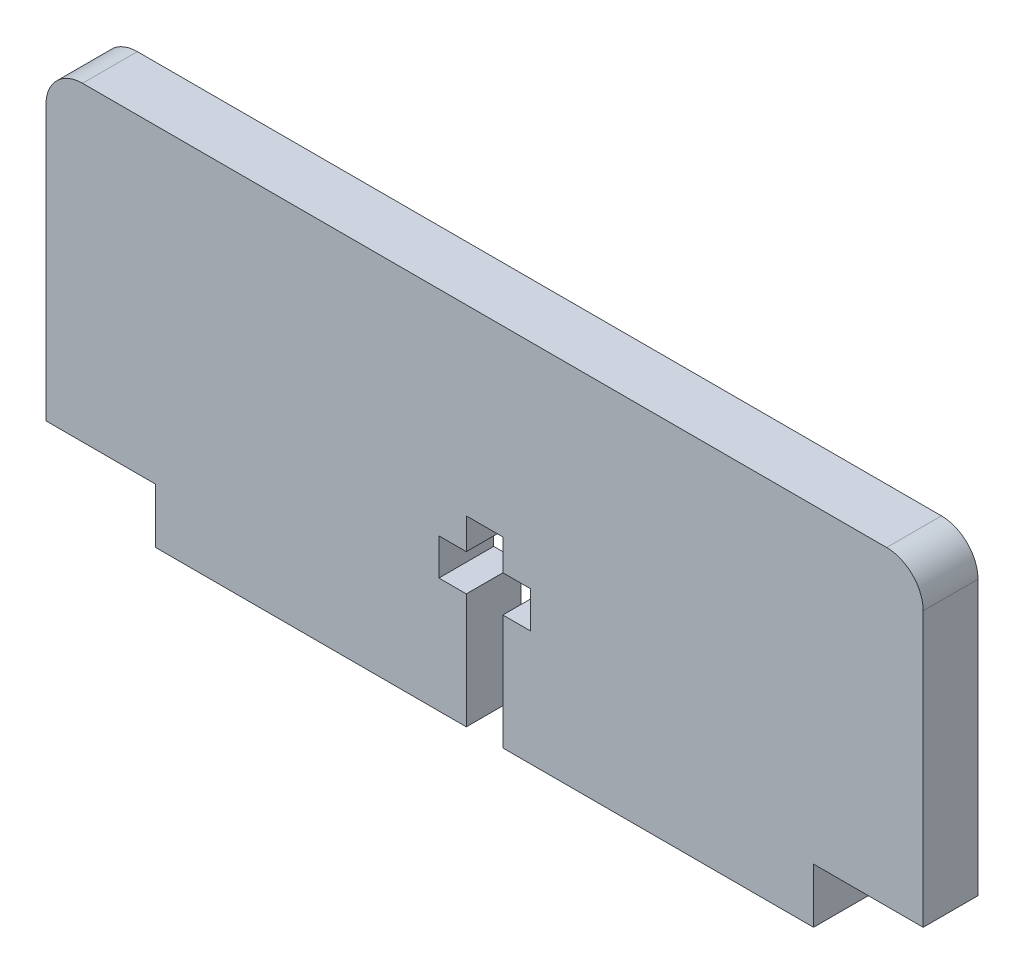
ISO-10303-21;
HEADER;
FILE_DESCRIPTION(('STEP AP214'),'2;1');
FILE_NAME('part.step','',(''),(''),'','','');
FILE_SCHEMA(('AUTOMOTIVE_DESIGN { 1 0 10303 214 1 1 1 1 }'));
ENDSEC;
DATA;
#1=APPLICATION_CONTEXT('core data for automotive mechanical design processes');
#2=APPLICATION_PROTOCOL_DEFINITION('international standard','automotive_design',2000,#1);
#3=PRODUCT_CONTEXT('',#1,'mechanical');
#4=PRODUCT('Part','Part','',(#3));
#5=PRODUCT_RELATED_PRODUCT_CATEGORY('part','',(#4));
#6=PRODUCT_DEFINITION_FORMATION('','',#4);
#7=PRODUCT_DEFINITION_CONTEXT('part definition',#1,'design');
#8=PRODUCT_DEFINITION('design','',#6,#7);
#9=PRODUCT_DEFINITION_SHAPE('','',#8);
#10=(LENGTH_UNIT() NAMED_UNIT(*) SI_UNIT(.MILLI.,.METRE.));
#11=(NAMED_UNIT(*) PLANE_ANGLE_UNIT() SI_UNIT($,.RADIAN.));
#12=(NAMED_UNIT(*) SI_UNIT($,.STERADIAN.) SOLID_ANGLE_UNIT());
#13=UNCERTAINTY_MEASURE_WITH_UNIT(LENGTH_MEASURE(1.E-05),#10,'distance_accuracy_value','');
#14=(GEOMETRIC_REPRESENTATION_CONTEXT(3) GLOBAL_UNCERTAINTY_ASSIGNED_CONTEXT((#13)) GLOBAL_UNIT_ASSIGNED_CONTEXT((#10,
#11,#12)) REPRESENTATION_CONTEXT('',''));
#15=CARTESIAN_POINT('',(0.,0.,0.));
#16=DIRECTION('',(0.,0.,1.));
#17=DIRECTION('',(1.,0.,0.));
#18=AXIS2_PLACEMENT_3D('',#15,#16,#17);
#19=CARTESIAN_POINT('',(-120.,0.,15.));
#20=DIRECTION('',(0.,1.,0.));
#21=DIRECTION('',(0.,0.,1.));
#22=AXIS2_PLACEMENT_3D('',#19,#20,#21);
#23=PLANE('',#22);
#24=DIRECTION('',(0.,0.,1.));
#25=VECTOR('',#24,1.);
#26=CARTESIAN_POINT('',(5.00000000000007,0.,0.));
#27=LINE('',#26,#25);
#28=CARTESIAN_POINT('',(5.00000000000006,0.,0.));
#29=VERTEX_POINT('',#28);
#30=CARTESIAN_POINT('',(5.00000000000007,0.,15.));
#31=VERTEX_POINT('',#30);
#32=EDGE_CURVE('E254',#29,#31,#27,.T.);
#33=ORIENTED_EDGE('',*,*,#32,.F.);
#34=DIRECTION('',(1.,0.,0.));
#35=VECTOR('',#34,1.);
#36=CARTESIAN_POINT('',(-120.,0.,0.));
#37=LINE('',#36,#35);
#38=CARTESIAN_POINT('',(90.,0.,0.));
#39=VERTEX_POINT('',#38);
#40=EDGE_CURVE('E340',#29,#39,#37,.T.);
#41=ORIENTED_EDGE('',*,*,#40,.T.);
#42=DIRECTION('',(0.,0.,1.));
#43=VECTOR('',#42,1.);
#44=CARTESIAN_POINT('',(90.,0.,0.));
#45=LINE('',#44,#43);
#46=CARTESIAN_POINT('',(90.,0.,15.));
#47=VERTEX_POINT('',#46);
#48=EDGE_CURVE('E235',#39,#47,#45,.T.);
#49=ORIENTED_EDGE('',*,*,#48,.T.);
#50=DIRECTION('',(1.,0.,0.));
#51=VECTOR('',#50,1.);
#52=CARTESIAN_POINT('',(-120.,0.,15.));
#53=LINE('',#52,#51);
#54=EDGE_CURVE('E324',#31,#47,#53,.T.);
#55=ORIENTED_EDGE('',*,*,#54,.F.);
#56=EDGE_LOOP('',(#33,#41,#49,#55));
#57=FACE_BOUND('',#56,.T.);
#58=ADVANCED_FACE('F56',(#57),#23,.F.);
#59=CARTESIAN_POINT('',(110.,90.,15.));
#60=DIRECTION('',(0.,0.,1.));
#61=DIRECTION('',(1.,0.,0.));
#62=AXIS2_PLACEMENT_3D('',#59,#60,#61);
#63=PLANE('',#62);
#64=DIRECTION('',(0.,-1.,0.));
#65=VECTOR('',#64,1.);
#66=CARTESIAN_POINT('',(-4.99999999999993,50.,15.));
#67=LINE('',#66,#65);
#68=CARTESIAN_POINT('',(-4.99999999999993,31.5158472255241,15.));
#69=VERTEX_POINT('',#68);
#70=CARTESIAN_POINT('',(-4.99999999999993,0.,15.));
#71=VERTEX_POINT('',#70);
#72=EDGE_CURVE('E265',#69,#71,#67,.T.);
#73=ORIENTED_EDGE('',*,*,#72,.F.);
#74=DIRECTION('',(1.,0.,0.));
#75=VECTOR('',#74,1.);
#76=CARTESIAN_POINT('',(-12.4999999999999,31.5158472255241,15.));
#77=LINE('',#76,#75);
#78=CARTESIAN_POINT('',(-12.4999999999999,31.5158472255241,15.));
#79=VERTEX_POINT('',#78);
#80=EDGE_CURVE('E231',#79,#69,#77,.T.);
#81=ORIENTED_EDGE('',*,*,#80,.F.);
#82=DIRECTION('',(0.,-1.,0.));
#83=VECTOR('',#82,1.);
#84=CARTESIAN_POINT('',(-12.4999999999999,41.5158472255241,15.));
#85=LINE('',#84,#83);
#86=CARTESIAN_POINT('',(-12.4999999999999,41.5158472255241,15.));
#87=VERTEX_POINT('',#86);
#88=EDGE_CURVE('E209',#87,#79,#85,.T.);
#89=ORIENTED_EDGE('',*,*,#88,.F.);
#90=DIRECTION('',(1.,0.,0.));
#91=VECTOR('',#90,1.);
#92=CARTESIAN_POINT('',(-12.4999999999999,41.5158472255241,15.));
#93=LINE('',#92,#91);
#94=CARTESIAN_POINT('',(-4.99999999999993,41.5158472255241,15.));
#95=VERTEX_POINT('',#94);
#96=EDGE_CURVE('E220',#87,#95,#93,.T.);
#97=ORIENTED_EDGE('',*,*,#96,.T.);
#98=CARTESIAN_POINT('',(-4.99999999999993,50.,15.));
#99=VERTEX_POINT('',#98);
#100=EDGE_CURVE('E263',#99,#95,#67,.T.);
#101=ORIENTED_EDGE('',*,*,#100,.F.);
#102=DIRECTION('',(1.,0.,0.));
#103=VECTOR('',#102,1.);
#104=CARTESIAN_POINT('',(-4.99999999999993,50.,15.));
#105=LINE('',#104,#103);
#106=CARTESIAN_POINT('',(5.00000000000007,50.,15.));
#107=VERTEX_POINT('',#106);
#108=EDGE_CURVE('E217',#99,#107,#105,.T.);
#109=ORIENTED_EDGE('',*,*,#108,.T.);
#110=DIRECTION('',(0.,-1.,0.));
#111=VECTOR('',#110,1.);
#112=CARTESIAN_POINT('',(5.00000000000007,50.,15.));
#113=LINE('',#112,#111);
#114=CARTESIAN_POINT('',(5.00000000000007,41.5158472255241,15.));
#115=VERTEX_POINT('',#114);
#116=EDGE_CURVE('E267',#107,#115,#113,.T.);
#117=ORIENTED_EDGE('',*,*,#116,.T.);
#118=CARTESIAN_POINT('',(12.5000000000001,41.5158472255241,15.));
#119=VERTEX_POINT('',#118);
#120=EDGE_CURVE('E226',#115,#119,#93,.T.);
#121=ORIENTED_EDGE('',*,*,#120,.T.);
#122=DIRECTION('',(0.,-1.,0.));
#123=VECTOR('',#122,1.);
#124=CARTESIAN_POINT('',(12.5000000000001,41.5158472255241,15.));
#125=LINE('',#124,#123);
#126=CARTESIAN_POINT('',(12.5000000000001,31.5158472255241,15.));
#127=VERTEX_POINT('',#126);
#128=EDGE_CURVE('E389',#119,#127,#125,.T.);
#129=ORIENTED_EDGE('',*,*,#128,.T.);
#130=CARTESIAN_POINT('',(5.00000000000007,31.5158472255241,15.));
#131=VERTEX_POINT('',#130);
#132=EDGE_CURVE('E233',#131,#127,#77,.T.);
#133=ORIENTED_EDGE('',*,*,#132,.F.);
#134=EDGE_CURVE('E270',#131,#31,#113,.T.);
#135=ORIENTED_EDGE('',*,*,#134,.T.);
#136=ORIENTED_EDGE('',*,*,#54,.T.);
#137=DIRECTION('',(0.,-1.,0.));
#138=VECTOR('',#137,1.);
#139=CARTESIAN_POINT('',(90.,0.,15.));
#140=LINE('',#139,#138);
#141=CARTESIAN_POINT('',(90.,15.,15.));
#142=VERTEX_POINT('',#141);
#143=EDGE_CURVE('E285',#142,#47,#140,.T.);
#144=ORIENTED_EDGE('',*,*,#143,.F.);
#145=DIRECTION('',(1.,0.,0.));
#146=VECTOR('',#145,1.);
#147=CARTESIAN_POINT('',(0.,15.,15.));
#148=LINE('',#147,#146);
#149=CARTESIAN_POINT('',(120.,15.,15.));
#150=VERTEX_POINT('',#149);
#151=EDGE_CURVE('E288',#142,#150,#148,.T.);
#152=ORIENTED_EDGE('',*,*,#151,.T.);
#153=DIRECTION('',(0.,1.,0.));
#154=VECTOR('',#153,1.);
#155=CARTESIAN_POINT('',(120.,0.,15.));
#156=LINE('',#155,#154);
#157=CARTESIAN_POINT('',(120.,90.,15.));
#158=VERTEX_POINT('',#157);
#159=EDGE_CURVE('E312',#150,#158,#156,.T.);
#160=ORIENTED_EDGE('',*,*,#159,.T.);
#161=CARTESIAN_POINT('',(110.,90.,15.));
#162=DIRECTION('',(0.,0.,1.));
#163=DIRECTION('',(1.,0.,0.));
#164=AXIS2_PLACEMENT_3D('',#161,#162,#163);
#165=CIRCLE('',#164,9.99999999999999);
#166=CARTESIAN_POINT('',(110.,100.,15.));
#167=VERTEX_POINT('',#166);
#168=EDGE_CURVE('E314',#158,#167,#165,.T.);
#169=ORIENTED_EDGE('',*,*,#168,.T.);
#170=DIRECTION('',(-1.,0.,0.));
#171=VECTOR('',#170,1.);
#172=CARTESIAN_POINT('',(110.,100.,15.));
#173=LINE('',#172,#171);
#174=CARTESIAN_POINT('',(-110.,100.,15.));
#175=VERTEX_POINT('',#174);
#176=EDGE_CURVE('E317',#167,#175,#173,.T.);
#177=ORIENTED_EDGE('',*,*,#176,.T.);
#178=CARTESIAN_POINT('',(-110.,90.,15.));
#179=DIRECTION('',(0.,0.,1.));
#180=DIRECTION('',(-1.,0.,0.));
#181=AXIS2_PLACEMENT_3D('',#178,#179,#180);
#182=CIRCLE('',#181,9.99999999999999);
#183=CARTESIAN_POINT('',(-120.,90.,15.));
#184=VERTEX_POINT('',#183);
#185=EDGE_CURVE('E319',#175,#184,#182,.T.);
#186=ORIENTED_EDGE('',*,*,#185,.T.);
#187=DIRECTION('',(0.,-1.,0.));
#188=VECTOR('',#187,1.);
#189=CARTESIAN_POINT('',(-120.,75.4145188432739,15.));
#190=LINE('',#189,#188);
#191=CARTESIAN_POINT('',(-120.,15.,15.));
#192=VERTEX_POINT('',#191);
#193=EDGE_CURVE('E321',#184,#192,#190,.T.);
#194=ORIENTED_EDGE('',*,*,#193,.T.);
#195=DIRECTION('',(-1.,0.,0.));
#196=VECTOR('',#195,1.);
#197=CARTESIAN_POINT('',(0.,15.,15.));
#198=LINE('',#197,#196);
#199=CARTESIAN_POINT('',(-89.9999999999998,15.,15.));
#200=VERTEX_POINT('',#199);
#201=EDGE_CURVE('E298',#200,#192,#198,.T.);
#202=ORIENTED_EDGE('',*,*,#201,.F.);
#203=DIRECTION('',(0.,-1.,0.));
#204=VECTOR('',#203,1.);
#205=CARTESIAN_POINT('',(-89.9999999999998,0.,15.));
#206=LINE('',#205,#204);
#207=CARTESIAN_POINT('',(-89.9999999999998,0.,15.));
#208=VERTEX_POINT('',#207);
#209=EDGE_CURVE('E291',#200,#208,#206,.T.);
#210=ORIENTED_EDGE('',*,*,#209,.T.);
#211=EDGE_CURVE('E325',#208,#71,#53,.T.);
#212=ORIENTED_EDGE('',*,*,#211,.T.);
#213=EDGE_LOOP('',(#73,#81,#89,#97,#101,#109,#117,#121,#129,#133,#135,#136,#144,#152,#160,#169,
#177,#186,#194,#202,#210,#212));
#214=FACE_BOUND('',#213,.T.);
#215=ADVANCED_FACE('F229',(#214),#63,.T.);
#216=CARTESIAN_POINT('',(110.,90.,0.));
#217=DIRECTION('',(0.,0.,1.));
#218=DIRECTION('',(1.,0.,0.));
#219=AXIS2_PLACEMENT_3D('',#216,#217,#218);
#220=PLANE('',#219);
#221=DIRECTION('',(1.,0.,0.));
#222=VECTOR('',#221,1.);
#223=CARTESIAN_POINT('',(-12.4999999999999,31.5158472255241,0.));
#224=LINE('',#223,#222);
#225=CARTESIAN_POINT('',(-12.4999999999999,31.5158472255241,0.));
#226=VERTEX_POINT('',#225);
#227=CARTESIAN_POINT('',(-4.99999999999993,31.5158472255241,0.));
#228=VERTEX_POINT('',#227);
#229=EDGE_CURVE('E246',#226,#228,#224,.T.);
#230=ORIENTED_EDGE('',*,*,#229,.T.);
#231=DIRECTION('',(0.,-1.,0.));
#232=VECTOR('',#231,1.);
#233=CARTESIAN_POINT('',(-4.99999999999993,50.,0.));
#234=LINE('',#233,#232);
#235=CARTESIAN_POINT('',(-4.99999999999993,0.,0.));
#236=VERTEX_POINT('',#235);
#237=EDGE_CURVE('E275',#228,#236,#234,.T.);
#238=ORIENTED_EDGE('',*,*,#237,.T.);
#239=CARTESIAN_POINT('',(-89.9999999999998,0.,0.));
#240=VERTEX_POINT('',#239);
#241=EDGE_CURVE('E315',#240,#236,#37,.T.);
#242=ORIENTED_EDGE('',*,*,#241,.F.);
#243=DIRECTION('',(0.,-1.,0.));
#244=VECTOR('',#243,1.);
#245=CARTESIAN_POINT('',(-89.9999999999998,0.,0.));
#246=LINE('',#245,#244);
#247=CARTESIAN_POINT('',(-89.9999999999998,15.,0.));
#248=VERTEX_POINT('',#247);
#249=EDGE_CURVE('E295',#248,#240,#246,.T.);
#250=ORIENTED_EDGE('',*,*,#249,.F.);
#251=DIRECTION('',(-1.,0.,0.));
#252=VECTOR('',#251,1.);
#253=CARTESIAN_POINT('',(0.,15.,0.));
#254=LINE('',#253,#252);
#255=CARTESIAN_POINT('',(-120.,15.,0.));
#256=VERTEX_POINT('',#255);
#257=EDGE_CURVE('E297',#248,#256,#254,.T.);
#258=ORIENTED_EDGE('',*,*,#257,.T.);
#259=DIRECTION('',(0.,-1.,0.));
#260=VECTOR('',#259,1.);
#261=CARTESIAN_POINT('',(-120.,0.,0.));
#262=LINE('',#261,#260);
#263=CARTESIAN_POINT('',(-120.,90.,0.));
#264=VERTEX_POINT('',#263);
#265=EDGE_CURVE('E337',#264,#256,#262,.T.);
#266=ORIENTED_EDGE('',*,*,#265,.F.);
#267=CARTESIAN_POINT('',(-110.,90.,0.));
#268=DIRECTION('',(0.,0.,1.));
#269=DIRECTION('',(-1.,0.,0.));
#270=AXIS2_PLACEMENT_3D('',#267,#268,#269);
#271=CIRCLE('',#270,9.99999999999999);
#272=CARTESIAN_POINT('',(-110.,100.,0.));
#273=VERTEX_POINT('',#272);
#274=EDGE_CURVE('E334',#273,#264,#271,.T.);
#275=ORIENTED_EDGE('',*,*,#274,.F.);
#276=DIRECTION('',(-1.,0.,0.));
#277=VECTOR('',#276,1.);
#278=CARTESIAN_POINT('',(110.,100.,0.));
#279=LINE('',#278,#277);
#280=CARTESIAN_POINT('',(110.,100.,0.));
#281=VERTEX_POINT('',#280);
#282=EDGE_CURVE('E332',#281,#273,#279,.T.);
#283=ORIENTED_EDGE('',*,*,#282,.F.);
#284=CARTESIAN_POINT('',(110.,90.,0.));
#285=DIRECTION('',(0.,0.,1.));
#286=DIRECTION('',(1.,0.,0.));
#287=AXIS2_PLACEMENT_3D('',#284,#285,#286);
#288=CIRCLE('',#287,9.99999999999999);
#289=CARTESIAN_POINT('',(120.,90.,0.));
#290=VERTEX_POINT('',#289);
#291=EDGE_CURVE('E330',#290,#281,#288,.T.);
#292=ORIENTED_EDGE('',*,*,#291,.F.);
#293=DIRECTION('',(0.,1.,0.));
#294=VECTOR('',#293,1.);
#295=CARTESIAN_POINT('',(120.,75.4145188432739,0.));
#296=LINE('',#295,#294);
#297=CARTESIAN_POINT('',(120.,15.,0.));
#298=VERTEX_POINT('',#297);
#299=EDGE_CURVE('E307',#298,#290,#296,.T.);
#300=ORIENTED_EDGE('',*,*,#299,.F.);
#301=DIRECTION('',(1.,0.,0.));
#302=VECTOR('',#301,1.);
#303=CARTESIAN_POINT('',(0.,15.,0.));
#304=LINE('',#303,#302);
#305=CARTESIAN_POINT('',(90.,15.,0.));
#306=VERTEX_POINT('',#305);
#307=EDGE_CURVE('E79',#306,#298,#304,.T.);
#308=ORIENTED_EDGE('',*,*,#307,.F.);
#309=DIRECTION('',(0.,-1.,0.));
#310=VECTOR('',#309,1.);
#311=CARTESIAN_POINT('',(90.,0.,0.));
#312=LINE('',#311,#310);
#313=EDGE_CURVE('E282',#306,#39,#312,.T.);
#314=ORIENTED_EDGE('',*,*,#313,.T.);
#315=ORIENTED_EDGE('',*,*,#40,.F.);
#316=DIRECTION('',(0.,-1.,0.));
#317=VECTOR('',#316,1.);
#318=CARTESIAN_POINT('',(5.00000000000007,50.,0.));
#319=LINE('',#318,#317);
#320=CARTESIAN_POINT('',(5.00000000000007,31.5158472255241,0.));
#321=VERTEX_POINT('',#320);
#322=EDGE_CURVE('E71',#321,#29,#319,.T.);
#323=ORIENTED_EDGE('',*,*,#322,.F.);
#324=CARTESIAN_POINT('',(12.5000000000001,31.5158472255241,0.));
#325=VERTEX_POINT('',#324);
#326=EDGE_CURVE('E249',#321,#325,#224,.T.);
#327=ORIENTED_EDGE('',*,*,#326,.T.);
#328=DIRECTION('',(0.,-1.,0.));
#329=VECTOR('',#328,1.);
#330=CARTESIAN_POINT('',(12.5000000000001,41.5158472255241,0.));
#331=LINE('',#330,#329);
#332=CARTESIAN_POINT('',(12.5000000000001,41.5158472255241,0.));
#333=VERTEX_POINT('',#332);
#334=EDGE_CURVE('E244',#333,#325,#331,.T.);
#335=ORIENTED_EDGE('',*,*,#334,.F.);
#336=DIRECTION('',(1.,0.,0.));
#337=VECTOR('',#336,1.);
#338=CARTESIAN_POINT('',(-12.4999999999999,41.5158472255241,0.));
#339=LINE('',#338,#337);
#340=CARTESIAN_POINT('',(5.00000000000007,41.5158472255241,0.));
#341=VERTEX_POINT('',#340);
#342=EDGE_CURVE('E242',#341,#333,#339,.T.);
#343=ORIENTED_EDGE('',*,*,#342,.F.);
#344=CARTESIAN_POINT('',(5.00000000000007,50.,0.));
#345=VERTEX_POINT('',#344);
#346=EDGE_CURVE('E276',#345,#341,#319,.T.);
#347=ORIENTED_EDGE('',*,*,#346,.F.);
#348=DIRECTION('',(1.,0.,0.));
#349=VECTOR('',#348,1.);
#350=CARTESIAN_POINT('',(-4.99999999999993,50.,0.));
#351=LINE('',#350,#349);
#352=CARTESIAN_POINT('',(-4.99999999999993,50.,0.));
#353=VERTEX_POINT('',#352);
#354=EDGE_CURVE('E266',#353,#345,#351,.T.);
#355=ORIENTED_EDGE('',*,*,#354,.F.);
#356=CARTESIAN_POINT('',(-4.99999999999993,41.5158472255241,0.));
#357=VERTEX_POINT('',#356);
#358=EDGE_CURVE('E262',#353,#357,#234,.T.);
#359=ORIENTED_EDGE('',*,*,#358,.T.);
#360=CARTESIAN_POINT('',(-12.4999999999999,41.5158472255241,0.));
#361=VERTEX_POINT('',#360);
#362=EDGE_CURVE('E240',#361,#357,#339,.T.);
#363=ORIENTED_EDGE('',*,*,#362,.F.);
#364=DIRECTION('',(0.,-1.,0.));
#365=VECTOR('',#364,1.);
#366=CARTESIAN_POINT('',(-12.4999999999999,41.5158472255241,0.));
#367=LINE('',#366,#365);
#368=EDGE_CURVE('E212',#361,#226,#367,.T.);
#369=ORIENTED_EDGE('',*,*,#368,.T.);
#370=EDGE_LOOP('',(#230,#238,#242,#250,#258,#266,#275,#283,#292,#300,#308,#314,#315,#323,#327,
#335,#343,#347,#355,#359,#363,#369));
#371=FACE_BOUND('',#370,.T.);
#372=ADVANCED_FACE('F359',(#371),#220,.F.);
#373=CARTESIAN_POINT('',(120.,75.4145188432739,15.));
#374=DIRECTION('',(-1.,0.,0.));
#375=DIRECTION('',(0.,0.,1.));
#376=AXIS2_PLACEMENT_3D('',#373,#374,#375);
#377=PLANE('',#376);
#378=DIRECTION('',(0.,0.,1.));
#379=VECTOR('',#378,1.);
#380=CARTESIAN_POINT('',(120.,15.,0.));
#381=LINE('',#380,#379);
#382=EDGE_CURVE('E232',#298,#150,#381,.T.);
#383=ORIENTED_EDGE('',*,*,#382,.F.);
#384=ORIENTED_EDGE('',*,*,#299,.T.);
#385=DIRECTION('',(0.,0.,-1.));
#386=VECTOR('',#385,1.);
#387=CARTESIAN_POINT('',(120.,90.,15.));
#388=LINE('',#387,#386);
#389=EDGE_CURVE('E12',#158,#290,#388,.T.);
#390=ORIENTED_EDGE('',*,*,#389,.F.);
#391=ORIENTED_EDGE('',*,*,#159,.F.);
#392=EDGE_LOOP('',(#383,#384,#390,#391));
#393=FACE_BOUND('',#392,.T.);
#394=ADVANCED_FACE('F58',(#393),#377,.F.);
#395=ORIENTED_EDGE('',*,*,#241,.T.);
#396=DIRECTION('',(0.,0.,1.));
#397=VECTOR('',#396,1.);
#398=CARTESIAN_POINT('',(-4.99999999999993,0.,0.));
#399=LINE('',#398,#397);
#400=EDGE_CURVE('E257',#236,#71,#399,.T.);
#401=ORIENTED_EDGE('',*,*,#400,.T.);
#402=ORIENTED_EDGE('',*,*,#211,.F.);
#403=DIRECTION('',(0.,0.,1.));
#404=VECTOR('',#403,1.);
#405=CARTESIAN_POINT('',(-89.9999999999998,0.,0.));
#406=LINE('',#405,#404);
#407=EDGE_CURVE('E305',#240,#208,#406,.T.);
#408=ORIENTED_EDGE('',*,*,#407,.F.);
#409=EDGE_LOOP('',(#395,#401,#402,#408));
#410=FACE_BOUND('',#409,.T.);
#411=ADVANCED_FACE('F432',(#410),#23,.F.);
#412=CARTESIAN_POINT('',(110.,90.,15.));
#413=DIRECTION('',(0.,0.,-1.));
#414=DIRECTION('',(-1.,0.,0.));
#415=AXIS2_PLACEMENT_3D('',#412,#413,#414);
#416=CYLINDRICAL_SURFACE('',#415,9.99999999999999);
#417=ORIENTED_EDGE('',*,*,#291,.T.);
#418=DIRECTION('',(0.,0.,-1.));
#419=VECTOR('',#418,1.);
#420=CARTESIAN_POINT('',(110.,100.,15.));
#421=LINE('',#420,#419);
#422=EDGE_CURVE('E64',#167,#281,#421,.T.);
#423=ORIENTED_EDGE('',*,*,#422,.F.);
#424=ORIENTED_EDGE('',*,*,#168,.F.);
#425=ORIENTED_EDGE('',*,*,#389,.T.);
#426=EDGE_LOOP('',(#417,#423,#424,#425));
#427=FACE_BOUND('',#426,.T.);
#428=ADVANCED_FACE('F371',(#427),#416,.T.);
#429=CARTESIAN_POINT('',(110.,100.,15.));
#430=DIRECTION('',(0.,-1.,0.));
#431=DIRECTION('',(0.,0.,-1.));
#432=AXIS2_PLACEMENT_3D('',#429,#430,#431);
#433=PLANE('',#432);
#434=ORIENTED_EDGE('',*,*,#282,.T.);
#435=DIRECTION('',(0.,0.,-1.));
#436=VECTOR('',#435,1.);
#437=CARTESIAN_POINT('',(-110.,100.,15.));
#438=LINE('',#437,#436);
#439=EDGE_CURVE('E345',#175,#273,#438,.T.);
#440=ORIENTED_EDGE('',*,*,#439,.F.);
#441=ORIENTED_EDGE('',*,*,#176,.F.);
#442=ORIENTED_EDGE('',*,*,#422,.T.);
#443=EDGE_LOOP('',(#434,#440,#441,#442));
#444=FACE_BOUND('',#443,.T.);
#445=ADVANCED_FACE('F352',(#444),#433,.F.);
#446=CARTESIAN_POINT('',(-110.,90.,15.));
#447=DIRECTION('',(0.,0.,-1.));
#448=DIRECTION('',(-1.,0.,0.));
#449=AXIS2_PLACEMENT_3D('',#446,#447,#448);
#450=CYLINDRICAL_SURFACE('',#449,9.99999999999999);
#451=ORIENTED_EDGE('',*,*,#274,.T.);
#452=DIRECTION('',(0.,0.,-1.));
#453=VECTOR('',#452,1.);
#454=CARTESIAN_POINT('',(-120.,90.,15.));
#455=LINE('',#454,#453);
#456=EDGE_CURVE('E328',#184,#264,#455,.T.);
#457=ORIENTED_EDGE('',*,*,#456,.F.);
#458=ORIENTED_EDGE('',*,*,#185,.F.);
#459=ORIENTED_EDGE('',*,*,#439,.T.);
#460=EDGE_LOOP('',(#451,#457,#458,#459));
#461=FACE_BOUND('',#460,.T.);
#462=ADVANCED_FACE('F363',(#461),#450,.T.);
#463=CARTESIAN_POINT('',(-120.,0.,15.));
#464=DIRECTION('',(1.,0.,0.));
#465=DIRECTION('',(0.,0.,-1.));
#466=AXIS2_PLACEMENT_3D('',#463,#464,#465);
#467=PLANE('',#466);
#468=ORIENTED_EDGE('',*,*,#265,.T.);
#469=DIRECTION('',(0.,0.,1.));
#470=VECTOR('',#469,1.);
#471=CARTESIAN_POINT('',(-120.,15.,0.));
#472=LINE('',#471,#470);
#473=EDGE_CURVE('E308',#256,#192,#472,.T.);
#474=ORIENTED_EDGE('',*,*,#473,.T.);
#475=ORIENTED_EDGE('',*,*,#193,.F.);
#476=ORIENTED_EDGE('',*,*,#456,.T.);
#477=EDGE_LOOP('',(#468,#474,#475,#476));
#478=FACE_BOUND('',#477,.T.);
#479=ADVANCED_FACE('F367',(#478),#467,.F.);
#480=CARTESIAN_POINT('',(-89.9999999999998,0.,0.));
#481=DIRECTION('',(-1.,0.,0.));
#482=DIRECTION('',(0.,0.,1.));
#483=AXIS2_PLACEMENT_3D('',#480,#481,#482);
#484=PLANE('',#483);
#485=ORIENTED_EDGE('',*,*,#209,.F.);
#486=DIRECTION('',(0.,0.,1.));
#487=VECTOR('',#486,1.);
#488=CARTESIAN_POINT('',(-89.9999999999998,15.,0.));
#489=LINE('',#488,#487);
#490=EDGE_CURVE('E301',#248,#200,#489,.T.);
#491=ORIENTED_EDGE('',*,*,#490,.F.);
#492=ORIENTED_EDGE('',*,*,#249,.T.);
#493=ORIENTED_EDGE('',*,*,#407,.T.);
#494=EDGE_LOOP('',(#485,#491,#492,#493));
#495=FACE_BOUND('',#494,.T.);
#496=ADVANCED_FACE('F436',(#495),#484,.T.);
#497=CARTESIAN_POINT('',(0.,15.,0.));
#498=DIRECTION('',(0.,1.,0.));
#499=DIRECTION('',(-1.,0.,0.));
#500=AXIS2_PLACEMENT_3D('',#497,#498,#499);
#501=PLANE('',#500);
#502=ORIENTED_EDGE('',*,*,#201,.T.);
#503=ORIENTED_EDGE('',*,*,#473,.F.);
#504=ORIENTED_EDGE('',*,*,#257,.F.);
#505=ORIENTED_EDGE('',*,*,#490,.T.);
#506=EDGE_LOOP('',(#502,#503,#504,#505));
#507=FACE_BOUND('',#506,.T.);
#508=ADVANCED_FACE('F440',(#507),#501,.F.);
#509=CARTESIAN_POINT('',(0.,15.,0.));
#510=DIRECTION('',(0.,-1.,0.));
#511=DIRECTION('',(1.,0.,0.));
#512=AXIS2_PLACEMENT_3D('',#509,#510,#511);
#513=PLANE('',#512);
#514=ORIENTED_EDGE('',*,*,#151,.F.);
#515=DIRECTION('',(0.,0.,1.));
#516=VECTOR('',#515,1.);
#517=CARTESIAN_POINT('',(90.,15.,0.));
#518=LINE('',#517,#516);
#519=EDGE_CURVE('E280',#306,#142,#518,.T.);
#520=ORIENTED_EDGE('',*,*,#519,.F.);
#521=ORIENTED_EDGE('',*,*,#307,.T.);
#522=ORIENTED_EDGE('',*,*,#382,.T.);
#523=EDGE_LOOP('',(#514,#520,#521,#522));
#524=FACE_BOUND('',#523,.T.);
#525=ADVANCED_FACE('F442',(#524),#513,.T.);
#526=CARTESIAN_POINT('',(90.,0.,0.));
#527=DIRECTION('',(-1.,0.,0.));
#528=DIRECTION('',(0.,-1.,0.));
#529=AXIS2_PLACEMENT_3D('',#526,#527,#528);
#530=PLANE('',#529);
#531=ORIENTED_EDGE('',*,*,#143,.T.);
#532=ORIENTED_EDGE('',*,*,#48,.F.);
#533=ORIENTED_EDGE('',*,*,#313,.F.);
#534=ORIENTED_EDGE('',*,*,#519,.T.);
#535=EDGE_LOOP('',(#531,#532,#533,#534));
#536=FACE_BOUND('',#535,.T.);
#537=ADVANCED_FACE('F377',(#536),#530,.F.);
#538=CARTESIAN_POINT('',(-4.99999999999993,50.,0.));
#539=DIRECTION('',(-1.,0.,0.));
#540=DIRECTION('',(0.,-1.,0.));
#541=AXIS2_PLACEMENT_3D('',#538,#539,#540);
#542=PLANE('',#541);
#543=DIRECTION('',(0.,0.,1.));
#544=VECTOR('',#543,1.);
#545=CARTESIAN_POINT('',(-4.99999999999993,31.5158472255241,0.));
#546=LINE('',#545,#544);
#547=EDGE_CURVE('E255',#228,#69,#546,.T.);
#548=ORIENTED_EDGE('',*,*,#547,.T.);
#549=ORIENTED_EDGE('',*,*,#72,.T.);
#550=ORIENTED_EDGE('',*,*,#400,.F.);
#551=ORIENTED_EDGE('',*,*,#237,.F.);
#552=EDGE_LOOP('',(#548,#549,#550,#551));
#553=FACE_BOUND('',#552,.T.);
#554=ADVANCED_FACE('F429',(#553),#542,.F.);
#555=CARTESIAN_POINT('',(5.00000000000007,50.,0.));
#556=DIRECTION('',(-1.,0.,0.));
#557=DIRECTION('',(0.,-1.,0.));
#558=AXIS2_PLACEMENT_3D('',#555,#556,#557);
#559=PLANE('',#558);
#560=ORIENTED_EDGE('',*,*,#322,.T.);
#561=ORIENTED_EDGE('',*,*,#32,.T.);
#562=ORIENTED_EDGE('',*,*,#134,.F.);
#563=DIRECTION('',(0.,0.,1.));
#564=VECTOR('',#563,1.);
#565=CARTESIAN_POINT('',(5.00000000000007,31.5158472255241,0.));
#566=LINE('',#565,#564);
#567=EDGE_CURVE('E397',#321,#131,#566,.T.);
#568=ORIENTED_EDGE('',*,*,#567,.F.);
#569=EDGE_LOOP('',(#560,#561,#562,#568));
#570=FACE_BOUND('',#569,.T.);
#571=ADVANCED_FACE('F384',(#570),#559,.T.);
#572=ORIENTED_EDGE('',*,*,#358,.F.);
#573=DIRECTION('',(0.,0.,1.));
#574=VECTOR('',#573,1.);
#575=CARTESIAN_POINT('',(-4.99999999999993,50.,0.));
#576=LINE('',#575,#574);
#577=EDGE_CURVE('E260',#353,#99,#576,.T.);
#578=ORIENTED_EDGE('',*,*,#577,.T.);
#579=ORIENTED_EDGE('',*,*,#100,.T.);
#580=DIRECTION('',(0.,0.,1.));
#581=VECTOR('',#580,1.);
#582=CARTESIAN_POINT('',(-4.99999999999993,41.5158472255241,0.));
#583=LINE('',#582,#581);
#584=EDGE_CURVE('E222',#357,#95,#583,.T.);
#585=ORIENTED_EDGE('',*,*,#584,.F.);
#586=EDGE_LOOP('',(#572,#578,#579,#585));
#587=FACE_BOUND('',#586,.T.);
#588=ADVANCED_FACE('F421',(#587),#542,.F.);
#589=CARTESIAN_POINT('',(-4.99999999999993,50.,0.));
#590=DIRECTION('',(0.,-1.,0.));
#591=DIRECTION('',(0.,0.,-1.));
#592=AXIS2_PLACEMENT_3D('',#589,#590,#591);
#593=PLANE('',#592);
#594=ORIENTED_EDGE('',*,*,#108,.F.);
#595=ORIENTED_EDGE('',*,*,#577,.F.);
#596=ORIENTED_EDGE('',*,*,#354,.T.);
#597=DIRECTION('',(0.,0.,1.));
#598=VECTOR('',#597,1.);
#599=CARTESIAN_POINT('',(5.00000000000007,50.,0.));
#600=LINE('',#599,#598);
#601=EDGE_CURVE('E251',#345,#107,#600,.T.);
#602=ORIENTED_EDGE('',*,*,#601,.T.);
#603=EDGE_LOOP('',(#594,#595,#596,#602));
#604=FACE_BOUND('',#603,.T.);
#605=ADVANCED_FACE('F418',(#604),#593,.T.);
#606=DIRECTION('',(0.,0.,1.));
#607=VECTOR('',#606,1.);
#608=CARTESIAN_POINT('',(5.00000000000007,41.5158472255241,0.));
#609=LINE('',#608,#607);
#610=EDGE_CURVE('E409',#341,#115,#609,.T.);
#611=ORIENTED_EDGE('',*,*,#610,.T.);
#612=ORIENTED_EDGE('',*,*,#116,.F.);
#613=ORIENTED_EDGE('',*,*,#601,.F.);
#614=ORIENTED_EDGE('',*,*,#346,.T.);
#615=EDGE_LOOP('',(#611,#612,#613,#614));
#616=FACE_BOUND('',#615,.T.);
#617=ADVANCED_FACE('F415',(#616),#559,.T.);
#618=CARTESIAN_POINT('',(-12.4999999999999,41.5158472255241,0.));
#619=DIRECTION('',(-1.,0.,0.));
#620=DIRECTION('',(0.,0.,1.));
#621=AXIS2_PLACEMENT_3D('',#618,#619,#620);
#622=PLANE('',#621);
#623=ORIENTED_EDGE('',*,*,#88,.T.);
#624=DIRECTION('',(0.,0.,1.));
#625=VECTOR('',#624,1.);
#626=CARTESIAN_POINT('',(-12.4999999999999,31.5158472255241,0.));
#627=LINE('',#626,#625);
#628=EDGE_CURVE('E243',#226,#79,#627,.T.);
#629=ORIENTED_EDGE('',*,*,#628,.F.);
#630=ORIENTED_EDGE('',*,*,#368,.F.);
#631=DIRECTION('',(0.,0.,1.));
#632=VECTOR('',#631,1.);
#633=CARTESIAN_POINT('',(-12.4999999999999,41.5158472255241,0.));
#634=LINE('',#633,#632);
#635=EDGE_CURVE('E205',#361,#87,#634,.T.);
#636=ORIENTED_EDGE('',*,*,#635,.T.);
#637=EDGE_LOOP('',(#623,#629,#630,#636));
#638=FACE_BOUND('',#637,.T.);
#639=ADVANCED_FACE('F207',(#638),#622,.F.);
#640=CARTESIAN_POINT('',(-12.4999999999999,41.5158472255241,0.));
#641=DIRECTION('',(0.,-1.,0.));
#642=DIRECTION('',(0.,0.,-1.));
#643=AXIS2_PLACEMENT_3D('',#640,#641,#642);
#644=PLANE('',#643);
#645=ORIENTED_EDGE('',*,*,#584,.T.);
#646=ORIENTED_EDGE('',*,*,#96,.F.);
#647=ORIENTED_EDGE('',*,*,#635,.F.);
#648=ORIENTED_EDGE('',*,*,#362,.T.);
#649=EDGE_LOOP('',(#645,#646,#647,#648));
#650=FACE_BOUND('',#649,.T.);
#651=ADVANCED_FACE('F221',(#650),#644,.T.);
#652=CARTESIAN_POINT('',(-12.4999999999999,31.5158472255241,0.));
#653=DIRECTION('',(0.,-1.,0.));
#654=DIRECTION('',(0.,0.,-1.));
#655=AXIS2_PLACEMENT_3D('',#652,#653,#654);
#656=PLANE('',#655);
#657=ORIENTED_EDGE('',*,*,#229,.F.);
#658=ORIENTED_EDGE('',*,*,#628,.T.);
#659=ORIENTED_EDGE('',*,*,#80,.T.);
#660=ORIENTED_EDGE('',*,*,#547,.F.);
#661=EDGE_LOOP('',(#657,#658,#659,#660));
#662=FACE_BOUND('',#661,.T.);
#663=ADVANCED_FACE('F427',(#662),#656,.F.);
#664=ORIENTED_EDGE('',*,*,#342,.T.);
#665=DIRECTION('',(0.,0.,1.));
#666=VECTOR('',#665,1.);
#667=CARTESIAN_POINT('',(12.5000000000001,41.5158472255241,0.));
#668=LINE('',#667,#666);
#669=EDGE_CURVE('E216',#333,#119,#668,.T.);
#670=ORIENTED_EDGE('',*,*,#669,.T.);
#671=ORIENTED_EDGE('',*,*,#120,.F.);
#672=ORIENTED_EDGE('',*,*,#610,.F.);
#673=EDGE_LOOP('',(#664,#670,#671,#672));
#674=FACE_BOUND('',#673,.T.);
#675=ADVANCED_FACE('F408',(#674),#644,.T.);
#676=CARTESIAN_POINT('',(12.5000000000001,41.5158472255241,0.));
#677=DIRECTION('',(-1.,0.,0.));
#678=DIRECTION('',(0.,-1.,0.));
#679=AXIS2_PLACEMENT_3D('',#676,#677,#678);
#680=PLANE('',#679);
#681=ORIENTED_EDGE('',*,*,#128,.F.);
#682=ORIENTED_EDGE('',*,*,#669,.F.);
#683=ORIENTED_EDGE('',*,*,#334,.T.);
#684=DIRECTION('',(0.,0.,1.));
#685=VECTOR('',#684,1.);
#686=CARTESIAN_POINT('',(12.5000000000001,31.5158472255241,0.));
#687=LINE('',#686,#685);
#688=EDGE_CURVE('E395',#325,#127,#687,.T.);
#689=ORIENTED_EDGE('',*,*,#688,.T.);
#690=EDGE_LOOP('',(#681,#682,#683,#689));
#691=FACE_BOUND('',#690,.T.);
#692=ADVANCED_FACE('F399',(#691),#680,.T.);
#693=ORIENTED_EDGE('',*,*,#567,.T.);
#694=ORIENTED_EDGE('',*,*,#132,.T.);
#695=ORIENTED_EDGE('',*,*,#688,.F.);
#696=ORIENTED_EDGE('',*,*,#326,.F.);
#697=EDGE_LOOP('',(#693,#694,#695,#696));
#698=FACE_BOUND('',#697,.T.);
#699=ADVANCED_FACE('F393',(#698),#656,.F.);
#700=CLOSED_SHELL('',(#58,#215,#372,#394,#411,#428,#445,#462,#479,#496,#508,#525,#537,#554,#571,
#588,#605,#617,#639,#651,#663,#675,#692,#699));
#701=MANIFOLD_SOLID_BREP('B2',#700);
#702=ADVANCED_BREP_SHAPE_REPRESENTATION('',(#18,#701),#14);
#703=SHAPE_DEFINITION_REPRESENTATION(#9,#702);
ENDSEC;
END-ISO-10303-21;
